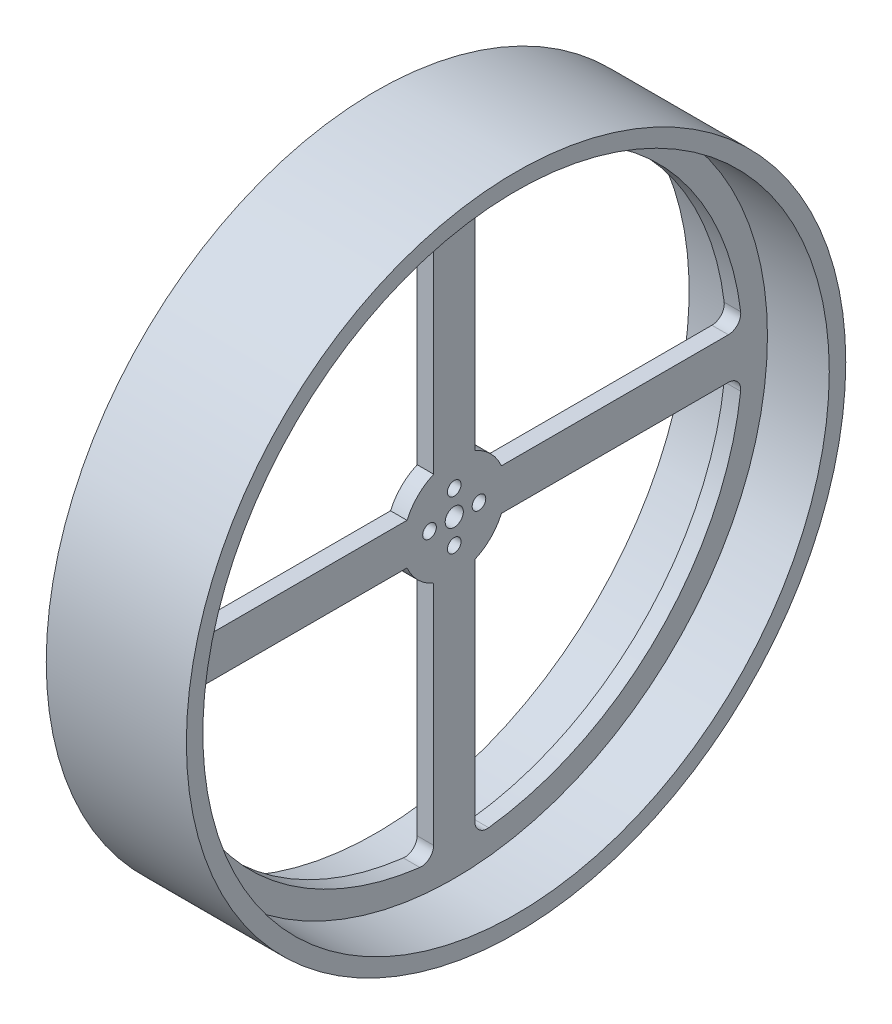
ISO-10303-21;
HEADER;
FILE_DESCRIPTION(('STEP AP214'),'2;1');
FILE_NAME('part.step','',(''),(''),'','','');
FILE_SCHEMA(('AUTOMOTIVE_DESIGN { 1 0 10303 214 1 1 1 1 }'));
ENDSEC;
DATA;
#1=APPLICATION_CONTEXT('core data for automotive mechanical design processes');
#2=APPLICATION_PROTOCOL_DEFINITION('international standard','automotive_design',2000,#1);
#3=PRODUCT_CONTEXT('',#1,'mechanical');
#4=PRODUCT('Part','Part','',(#3));
#5=PRODUCT_RELATED_PRODUCT_CATEGORY('part','',(#4));
#6=PRODUCT_DEFINITION_FORMATION('','',#4);
#7=PRODUCT_DEFINITION_CONTEXT('part definition',#1,'design');
#8=PRODUCT_DEFINITION('design','',#6,#7);
#9=PRODUCT_DEFINITION_SHAPE('','',#8);
#10=(LENGTH_UNIT() NAMED_UNIT(*) SI_UNIT(.MILLI.,.METRE.));
#11=(NAMED_UNIT(*) PLANE_ANGLE_UNIT() SI_UNIT($,.RADIAN.));
#12=(NAMED_UNIT(*) SI_UNIT($,.STERADIAN.) SOLID_ANGLE_UNIT());
#13=UNCERTAINTY_MEASURE_WITH_UNIT(LENGTH_MEASURE(1.E-05),#10,'distance_accuracy_value','');
#14=(GEOMETRIC_REPRESENTATION_CONTEXT(3) GLOBAL_UNCERTAINTY_ASSIGNED_CONTEXT((#13)) GLOBAL_UNIT_ASSIGNED_CONTEXT((#10,
#11,#12)) REPRESENTATION_CONTEXT('',''));
#15=CARTESIAN_POINT('',(0.,0.,0.));
#16=DIRECTION('',(0.,0.,1.));
#17=DIRECTION('',(1.,0.,0.));
#18=AXIS2_PLACEMENT_3D('',#15,#16,#17);
#19=CARTESIAN_POINT('',(4.,0.,0.));
#20=DIRECTION('',(1.,0.,0.));
#21=DIRECTION('',(0.,0.,-1.));
#22=AXIS2_PLACEMENT_3D('',#19,#20,#21);
#23=PLANE('',#22);
#24=CARTESIAN_POINT('',(4.,-6.,0.));
#25=DIRECTION('',(1.,0.,0.));
#26=DIRECTION('',(0.,0.,-1.));
#27=AXIS2_PLACEMENT_3D('',#24,#25,#26);
#28=CIRCLE('',#27,1.65);
#29=CARTESIAN_POINT('',(4.,-6.,-1.65));
#30=VERTEX_POINT('',#29);
#31=EDGE_CURVE('E338',#30,#30,#28,.T.);
#32=ORIENTED_EDGE('',*,*,#31,.F.);
#33=EDGE_LOOP('',(#32));
#34=FACE_BOUND('',#33,.T.);
#35=CARTESIAN_POINT('',(4.,0.,-6.));
#36=DIRECTION('',(1.,0.,0.));
#37=DIRECTION('',(0.,0.,-1.));
#38=AXIS2_PLACEMENT_3D('',#35,#36,#37);
#39=CIRCLE('',#38,1.65);
#40=CARTESIAN_POINT('',(4.,0.,-7.65));
#41=VERTEX_POINT('',#40);
#42=EDGE_CURVE('E334',#41,#41,#39,.T.);
#43=ORIENTED_EDGE('',*,*,#42,.F.);
#44=EDGE_LOOP('',(#43));
#45=FACE_BOUND('',#44,.T.);
#46=CARTESIAN_POINT('',(4.,6.,0.));
#47=DIRECTION('',(1.,0.,0.));
#48=DIRECTION('',(0.,0.,-1.));
#49=AXIS2_PLACEMENT_3D('',#46,#47,#48);
#50=CIRCLE('',#49,1.65);
#51=CARTESIAN_POINT('',(4.,6.,-1.65));
#52=VERTEX_POINT('',#51);
#53=EDGE_CURVE('E328',#52,#52,#50,.T.);
#54=ORIENTED_EDGE('',*,*,#53,.F.);
#55=EDGE_LOOP('',(#54));
#56=FACE_BOUND('',#55,.T.);
#57=CARTESIAN_POINT('',(4.,0.,6.));
#58=DIRECTION('',(1.,0.,0.));
#59=DIRECTION('',(0.,0.,-1.));
#60=AXIS2_PLACEMENT_3D('',#57,#58,#59);
#61=CIRCLE('',#60,1.65);
#62=CARTESIAN_POINT('',(4.,0.,4.35));
#63=VERTEX_POINT('',#62);
#64=EDGE_CURVE('E323',#63,#63,#61,.T.);
#65=ORIENTED_EDGE('',*,*,#64,.F.);
#66=EDGE_LOOP('',(#65));
#67=FACE_BOUND('',#66,.T.);
#68=CARTESIAN_POINT('',(4.,0.,0.));
#69=DIRECTION('',(1.,0.,0.));
#70=DIRECTION('',(0.,0.,1.));
#71=AXIS2_PLACEMENT_3D('',#68,#69,#70);
#72=CIRCLE('',#71,70.);
#73=CARTESIAN_POINT('',(4.,69.4992110966795,8.35820895522388));
#74=VERTEX_POINT('',#73);
#75=CARTESIAN_POINT('',(4.,8.35820895522388,69.4992110966795));
#76=VERTEX_POINT('',#75);
#77=EDGE_CURVE('E212',#74,#76,#72,.T.);
#78=ORIENTED_EDGE('',*,*,#77,.F.);
#79=CARTESIAN_POINT('',(4.,66.5206734782503,8.));
#80=DIRECTION('',(1.,0.,0.));
#81=DIRECTION('',(0.,0.,-1.));
#82=AXIS2_PLACEMENT_3D('',#79,#80,#81);
#83=CIRCLE('',#82,3.);
#84=CARTESIAN_POINT('',(4.,66.5206734782503,5.));
#85=VERTEX_POINT('',#84);
#86=EDGE_CURVE('E405',#74,#85,#83,.F.);
#87=ORIENTED_EDGE('',*,*,#86,.T.);
#88=DIRECTION('',(0.,1.,0.));
#89=VECTOR('',#88,1.);
#90=CARTESIAN_POINT('',(4.,11.4564392373896,5.));
#91=LINE('',#90,#89);
#92=CARTESIAN_POINT('',(4.,11.4564392373896,5.));
#93=VERTEX_POINT('',#92);
#94=EDGE_CURVE('E296',#93,#85,#91,.T.);
#95=ORIENTED_EDGE('',*,*,#94,.F.);
#96=CARTESIAN_POINT('',(4.,0.,0.));
#97=DIRECTION('',(-1.,0.,0.));
#98=DIRECTION('',(0.,0.,1.));
#99=AXIS2_PLACEMENT_3D('',#96,#97,#98);
#100=CIRCLE('',#99,12.5);
#101=CARTESIAN_POINT('',(4.,4.99999999999999,11.4564392373896));
#102=VERTEX_POINT('',#101);
#103=EDGE_CURVE('E311',#102,#93,#100,.T.);
#104=ORIENTED_EDGE('',*,*,#103,.F.);
#105=DIRECTION('',(0.,0.,-1.));
#106=VECTOR('',#105,1.);
#107=CARTESIAN_POINT('',(4.,4.99999999999999,11.4564392373896));
#108=LINE('',#107,#106);
#109=CARTESIAN_POINT('',(4.,5.,66.5206734782503));
#110=VERTEX_POINT('',#109);
#111=EDGE_CURVE('E307',#110,#102,#108,.T.);
#112=ORIENTED_EDGE('',*,*,#111,.F.);
#113=CARTESIAN_POINT('',(4.,8.,66.5206734782503));
#114=DIRECTION('',(1.,0.,0.));
#115=DIRECTION('',(0.,0.,-1.));
#116=AXIS2_PLACEMENT_3D('',#113,#114,#115);
#117=CIRCLE('',#116,3.);
#118=EDGE_CURVE('E50',#110,#76,#117,.F.);
#119=ORIENTED_EDGE('',*,*,#118,.T.);
#120=EDGE_LOOP('',(#78,#87,#95,#104,#112,#119));
#121=FACE_BOUND('',#120,.T.);
#122=CARTESIAN_POINT('',(4.,0.,0.));
#123=DIRECTION('',(1.,0.,0.));
#124=DIRECTION('',(0.,-1.,0.));
#125=AXIS2_PLACEMENT_3D('',#122,#123,#124);
#126=CIRCLE('',#125,70.);
#127=CARTESIAN_POINT('',(4.,-8.35820895522315,69.4992110966796));
#128=VERTEX_POINT('',#127);
#129=CARTESIAN_POINT('',(4.,-69.4992110966794,8.35820895522461));
#130=VERTEX_POINT('',#129);
#131=EDGE_CURVE('E281',#128,#130,#126,.T.);
#132=ORIENTED_EDGE('',*,*,#131,.F.);
#133=CARTESIAN_POINT('',(4.,-7.9999999999993,66.5206734782504));
#134=DIRECTION('',(1.,0.,0.));
#135=DIRECTION('',(0.,0.,-1.));
#136=AXIS2_PLACEMENT_3D('',#133,#134,#135);
#137=CIRCLE('',#136,3.);
#138=CARTESIAN_POINT('',(4.,-4.9999999999993,66.5206734782504));
#139=VERTEX_POINT('',#138);
#140=EDGE_CURVE('E407',#128,#139,#137,.F.);
#141=ORIENTED_EDGE('',*,*,#140,.T.);
#142=DIRECTION('',(0.,0.,1.));
#143=VECTOR('',#142,1.);
#144=CARTESIAN_POINT('',(4.,-4.99999999999988,11.4564392373897));
#145=LINE('',#144,#143);
#146=CARTESIAN_POINT('',(4.,-4.99999999999988,11.4564392373897));
#147=VERTEX_POINT('',#146);
#148=EDGE_CURVE('E275',#147,#139,#145,.T.);
#149=ORIENTED_EDGE('',*,*,#148,.F.);
#150=CARTESIAN_POINT('',(4.,0.,0.));
#151=DIRECTION('',(-1.,0.,0.));
#152=DIRECTION('',(0.,-1.,0.));
#153=AXIS2_PLACEMENT_3D('',#150,#151,#152);
#154=CIRCLE('',#153,12.5);
#155=CARTESIAN_POINT('',(4.,-11.4564392373896,5.00000000000011));
#156=VERTEX_POINT('',#155);
#157=EDGE_CURVE('E290',#156,#147,#154,.T.);
#158=ORIENTED_EDGE('',*,*,#157,.F.);
#159=DIRECTION('',(0.,1.,0.));
#160=VECTOR('',#159,1.);
#161=CARTESIAN_POINT('',(4.,-11.4564392373896,5.00000000000011));
#162=LINE('',#161,#160);
#163=CARTESIAN_POINT('',(4.,-66.5206734782503,5.0000000000007));
#164=VERTEX_POINT('',#163);
#165=EDGE_CURVE('E282',#164,#156,#162,.T.);
#166=ORIENTED_EDGE('',*,*,#165,.F.);
#167=CARTESIAN_POINT('',(4.,-66.5206734782503,8.0000000000007));
#168=DIRECTION('',(1.,0.,0.));
#169=DIRECTION('',(0.,0.,-1.));
#170=AXIS2_PLACEMENT_3D('',#167,#168,#169);
#171=CIRCLE('',#170,3.);
#172=EDGE_CURVE('E385',#164,#130,#171,.F.);
#173=ORIENTED_EDGE('',*,*,#172,.T.);
#174=EDGE_LOOP('',(#132,#141,#149,#158,#166,#173));
#175=FACE_BOUND('',#174,.T.);
#176=CARTESIAN_POINT('',(4.,0.,0.));
#177=DIRECTION('',(1.,0.,0.));
#178=DIRECTION('',(0.,0.,-1.));
#179=AXIS2_PLACEMENT_3D('',#176,#177,#178);
#180=CIRCLE('',#179,70.);
#181=CARTESIAN_POINT('',(4.,-69.4992110966795,-8.35820895522388));
#182=VERTEX_POINT('',#181);
#183=CARTESIAN_POINT('',(4.,-8.35820895522388,-69.4992110966795));
#184=VERTEX_POINT('',#183);
#185=EDGE_CURVE('E251',#182,#184,#180,.T.);
#186=ORIENTED_EDGE('',*,*,#185,.F.);
#187=CARTESIAN_POINT('',(4.,-66.5206734782503,-8.));
#188=DIRECTION('',(1.,0.,0.));
#189=DIRECTION('',(0.,0.,-1.));
#190=AXIS2_PLACEMENT_3D('',#187,#188,#189);
#191=CIRCLE('',#190,3.);
#192=CARTESIAN_POINT('',(4.,-66.5206734782503,-5.));
#193=VERTEX_POINT('',#192);
#194=EDGE_CURVE('E387',#182,#193,#191,.F.);
#195=ORIENTED_EDGE('',*,*,#194,.T.);
#196=DIRECTION('',(0.,-1.,0.));
#197=VECTOR('',#196,1.);
#198=CARTESIAN_POINT('',(4.,-11.4564392373896,-5.));
#199=LINE('',#198,#197);
#200=CARTESIAN_POINT('',(4.,-11.4564392373896,-5.));
#201=VERTEX_POINT('',#200);
#202=EDGE_CURVE('E244',#201,#193,#199,.T.);
#203=ORIENTED_EDGE('',*,*,#202,.F.);
#204=CARTESIAN_POINT('',(4.,0.,0.));
#205=DIRECTION('',(-1.,0.,0.));
#206=DIRECTION('',(0.,0.,-1.));
#207=AXIS2_PLACEMENT_3D('',#204,#205,#206);
#208=CIRCLE('',#207,12.5);
#209=CARTESIAN_POINT('',(4.,-4.99999999999999,-11.4564392373896));
#210=VERTEX_POINT('',#209);
#211=EDGE_CURVE('E258',#210,#201,#208,.T.);
#212=ORIENTED_EDGE('',*,*,#211,.F.);
#213=DIRECTION('',(0.,0.,1.));
#214=VECTOR('',#213,1.);
#215=CARTESIAN_POINT('',(4.,-4.99999999999999,-11.4564392373896));
#216=LINE('',#215,#214);
#217=CARTESIAN_POINT('',(4.,-5.,-66.5206734782503));
#218=VERTEX_POINT('',#217);
#219=EDGE_CURVE('E260',#218,#210,#216,.T.);
#220=ORIENTED_EDGE('',*,*,#219,.F.);
#221=CARTESIAN_POINT('',(4.,-8.,-66.5206734782503));
#222=DIRECTION('',(1.,0.,0.));
#223=DIRECTION('',(0.,0.,-1.));
#224=AXIS2_PLACEMENT_3D('',#221,#222,#223);
#225=CIRCLE('',#224,3.);
#226=EDGE_CURVE('E388',#218,#184,#225,.F.);
#227=ORIENTED_EDGE('',*,*,#226,.T.);
#228=EDGE_LOOP('',(#186,#195,#203,#212,#220,#227));
#229=FACE_BOUND('',#228,.T.);
#230=CARTESIAN_POINT('',(4.,0.,0.));
#231=DIRECTION('',(1.,0.,0.));
#232=DIRECTION('',(0.,1.,0.));
#233=AXIS2_PLACEMENT_3D('',#230,#231,#232);
#234=CIRCLE('',#233,70.);
#235=CARTESIAN_POINT('',(4.,8.35820895522364,-69.4992110966795));
#236=VERTEX_POINT('',#235);
#237=CARTESIAN_POINT('',(4.,69.4992110966794,-8.35820895522412));
#238=VERTEX_POINT('',#237);
#239=EDGE_CURVE('E233',#236,#238,#234,.T.);
#240=ORIENTED_EDGE('',*,*,#239,.F.);
#241=CARTESIAN_POINT('',(4.,7.99999999999977,-66.5206734782504));
#242=DIRECTION('',(1.,0.,0.));
#243=DIRECTION('',(0.,0.,-1.));
#244=AXIS2_PLACEMENT_3D('',#241,#242,#243);
#245=CIRCLE('',#244,3.);
#246=CARTESIAN_POINT('',(4.,4.99999999999977,-66.5206734782504));
#247=VERTEX_POINT('',#246);
#248=EDGE_CURVE('E392',#236,#247,#245,.F.);
#249=ORIENTED_EDGE('',*,*,#248,.T.);
#250=DIRECTION('',(0.,0.,-1.));
#251=VECTOR('',#250,1.);
#252=CARTESIAN_POINT('',(4.,4.99999999999996,-11.4564392373896));
#253=LINE('',#252,#251);
#254=CARTESIAN_POINT('',(4.,4.99999999999996,-11.4564392373896));
#255=VERTEX_POINT('',#254);
#256=EDGE_CURVE('E238',#255,#247,#253,.T.);
#257=ORIENTED_EDGE('',*,*,#256,.F.);
#258=CARTESIAN_POINT('',(4.,0.,0.));
#259=DIRECTION('',(-1.,0.,0.));
#260=DIRECTION('',(0.,1.,0.));
#261=AXIS2_PLACEMENT_3D('',#258,#259,#260);
#262=CIRCLE('',#261,12.5);
#263=CARTESIAN_POINT('',(4.,11.4564392373896,-5.00000000000003));
#264=VERTEX_POINT('',#263);
#265=EDGE_CURVE('E210',#264,#255,#262,.T.);
#266=ORIENTED_EDGE('',*,*,#265,.F.);
#267=DIRECTION('',(0.,-1.,0.));
#268=VECTOR('',#267,1.);
#269=CARTESIAN_POINT('',(4.,11.4564392373896,-5.00000000000003));
#270=LINE('',#269,#268);
#271=CARTESIAN_POINT('',(4.,66.5206734782503,-5.00000000000023));
#272=VERTEX_POINT('',#271);
#273=EDGE_CURVE('E234',#272,#264,#270,.T.);
#274=ORIENTED_EDGE('',*,*,#273,.F.);
#275=CARTESIAN_POINT('',(4.,66.5206734782503,-8.00000000000023));
#276=DIRECTION('',(1.,0.,0.));
#277=DIRECTION('',(0.,0.,-1.));
#278=AXIS2_PLACEMENT_3D('',#275,#276,#277);
#279=CIRCLE('',#278,3.);
#280=EDGE_CURVE('E398',#272,#238,#279,.F.);
#281=ORIENTED_EDGE('',*,*,#280,.T.);
#282=EDGE_LOOP('',(#240,#249,#257,#266,#274,#281));
#283=FACE_BOUND('',#282,.T.);
#284=CARTESIAN_POINT('',(4.,0.,0.));
#285=DIRECTION('',(1.,0.,0.));
#286=DIRECTION('',(0.,0.,-1.));
#287=AXIS2_PLACEMENT_3D('',#284,#285,#286);
#288=CIRCLE('',#287,2.2);
#289=CARTESIAN_POINT('',(4.,0.,-2.2));
#290=VERTEX_POINT('',#289);
#291=EDGE_CURVE('E501',#290,#290,#288,.T.);
#292=ORIENTED_EDGE('',*,*,#291,.F.);
#293=EDGE_LOOP('',(#292));
#294=FACE_BOUND('',#293,.T.);
#295=CARTESIAN_POINT('',(4.,0.,0.));
#296=DIRECTION('',(1.,0.,0.));
#297=DIRECTION('',(0.,0.,-1.));
#298=AXIS2_PLACEMENT_3D('',#295,#296,#297);
#299=CIRCLE('',#298,76.);
#300=CARTESIAN_POINT('',(4.,0.,-76.));
#301=VERTEX_POINT('',#300);
#302=EDGE_CURVE('E507',#301,#301,#299,.T.);
#303=ORIENTED_EDGE('',*,*,#302,.T.);
#304=EDGE_LOOP('',(#303));
#305=FACE_BOUND('',#304,.T.);
#306=ADVANCED_FACE('F39',(#34,#45,#56,#67,#121,#175,#229,#283,#294,#305),#23,.T.);
#307=CARTESIAN_POINT('',(0.,0.,0.));
#308=DIRECTION('',(1.,0.,0.));
#309=DIRECTION('',(0.,0.,-1.));
#310=AXIS2_PLACEMENT_3D('',#307,#308,#309);
#311=PLANE('',#310);
#312=CARTESIAN_POINT('',(0.,0.,0.));
#313=DIRECTION('',(1.,0.,0.));
#314=DIRECTION('',(0.,0.,-1.));
#315=AXIS2_PLACEMENT_3D('',#312,#313,#314);
#316=CIRCLE('',#315,2.2);
#317=CARTESIAN_POINT('',(0.,0.,-2.2));
#318=VERTEX_POINT('',#317);
#319=EDGE_CURVE('E496',#318,#318,#316,.T.);
#320=ORIENTED_EDGE('',*,*,#319,.T.);
#321=EDGE_LOOP('',(#320));
#322=FACE_BOUND('',#321,.T.);
#323=CARTESIAN_POINT('',(0.,-6.,0.));
#324=DIRECTION('',(1.,0.,0.));
#325=DIRECTION('',(0.,0.,-1.));
#326=AXIS2_PLACEMENT_3D('',#323,#324,#325);
#327=CIRCLE('',#326,1.65);
#328=CARTESIAN_POINT('',(0.,-6.,-1.65));
#329=VERTEX_POINT('',#328);
#330=EDGE_CURVE('E319',#329,#329,#327,.T.);
#331=ORIENTED_EDGE('',*,*,#330,.T.);
#332=EDGE_LOOP('',(#331));
#333=FACE_BOUND('',#332,.T.);
#334=CARTESIAN_POINT('',(0.,0.,-6.));
#335=DIRECTION('',(1.,0.,0.));
#336=DIRECTION('',(0.,0.,-1.));
#337=AXIS2_PLACEMENT_3D('',#334,#335,#336);
#338=CIRCLE('',#337,1.65);
#339=CARTESIAN_POINT('',(0.,0.,-7.65));
#340=VERTEX_POINT('',#339);
#341=EDGE_CURVE('E340',#340,#340,#338,.T.);
#342=ORIENTED_EDGE('',*,*,#341,.T.);
#343=EDGE_LOOP('',(#342));
#344=FACE_BOUND('',#343,.T.);
#345=CARTESIAN_POINT('',(0.,6.,0.));
#346=DIRECTION('',(1.,0.,0.));
#347=DIRECTION('',(0.,0.,-1.));
#348=AXIS2_PLACEMENT_3D('',#345,#346,#347);
#349=CIRCLE('',#348,1.65);
#350=CARTESIAN_POINT('',(0.,6.,-1.65));
#351=VERTEX_POINT('',#350);
#352=EDGE_CURVE('E332',#351,#351,#349,.T.);
#353=ORIENTED_EDGE('',*,*,#352,.T.);
#354=EDGE_LOOP('',(#353));
#355=FACE_BOUND('',#354,.T.);
#356=CARTESIAN_POINT('',(0.,0.,6.));
#357=DIRECTION('',(1.,0.,0.));
#358=DIRECTION('',(0.,0.,-1.));
#359=AXIS2_PLACEMENT_3D('',#356,#357,#358);
#360=CIRCLE('',#359,1.65);
#361=CARTESIAN_POINT('',(0.,0.,4.35));
#362=VERTEX_POINT('',#361);
#363=EDGE_CURVE('E322',#362,#362,#360,.T.);
#364=ORIENTED_EDGE('',*,*,#363,.T.);
#365=EDGE_LOOP('',(#364));
#366=FACE_BOUND('',#365,.T.);
#367=DIRECTION('',(0.,1.,0.));
#368=VECTOR('',#367,1.);
#369=CARTESIAN_POINT('',(0.,11.4564392373896,5.));
#370=LINE('',#369,#368);
#371=CARTESIAN_POINT('',(0.,11.4564392373896,5.));
#372=VERTEX_POINT('',#371);
#373=CARTESIAN_POINT('',(0.,66.5206734782503,5.));
#374=VERTEX_POINT('',#373);
#375=EDGE_CURVE('E303',#372,#374,#370,.T.);
#376=ORIENTED_EDGE('',*,*,#375,.T.);
#377=CARTESIAN_POINT('',(0.,66.5206734782503,8.));
#378=DIRECTION('',(1.,0.,0.));
#379=DIRECTION('',(0.,0.,-1.));
#380=AXIS2_PLACEMENT_3D('',#377,#378,#379);
#381=CIRCLE('',#380,3.);
#382=CARTESIAN_POINT('',(0.,69.4992110966795,8.35820895522388));
#383=VERTEX_POINT('',#382);
#384=EDGE_CURVE('E404',#374,#383,#381,.T.);
#385=ORIENTED_EDGE('',*,*,#384,.T.);
#386=CARTESIAN_POINT('',(0.,0.,0.));
#387=DIRECTION('',(1.,0.,0.));
#388=DIRECTION('',(0.,0.,1.));
#389=AXIS2_PLACEMENT_3D('',#386,#387,#388);
#390=CIRCLE('',#389,70.);
#391=CARTESIAN_POINT('',(0.,8.35820895522388,69.4992110966795));
#392=VERTEX_POINT('',#391);
#393=EDGE_CURVE('E294',#383,#392,#390,.T.);
#394=ORIENTED_EDGE('',*,*,#393,.T.);
#395=CARTESIAN_POINT('',(0.,8.,66.5206734782503));
#396=DIRECTION('',(1.,0.,0.));
#397=DIRECTION('',(0.,0.,-1.));
#398=AXIS2_PLACEMENT_3D('',#395,#396,#397);
#399=CIRCLE('',#398,3.);
#400=CARTESIAN_POINT('',(0.,5.,66.5206734782503));
#401=VERTEX_POINT('',#400);
#402=EDGE_CURVE('E11',#392,#401,#399,.T.);
#403=ORIENTED_EDGE('',*,*,#402,.T.);
#404=DIRECTION('',(0.,0.,-1.));
#405=VECTOR('',#404,1.);
#406=CARTESIAN_POINT('',(0.,4.99999999999999,11.4564392373896));
#407=LINE('',#406,#405);
#408=CARTESIAN_POINT('',(0.,4.99999999999999,11.4564392373896));
#409=VERTEX_POINT('',#408);
#410=EDGE_CURVE('E300',#401,#409,#407,.T.);
#411=ORIENTED_EDGE('',*,*,#410,.T.);
#412=CARTESIAN_POINT('',(0.,0.,0.));
#413=DIRECTION('',(-1.,0.,0.));
#414=DIRECTION('',(0.,0.,1.));
#415=AXIS2_PLACEMENT_3D('',#412,#413,#414);
#416=CIRCLE('',#415,12.5);
#417=EDGE_CURVE('E297',#409,#372,#416,.T.);
#418=ORIENTED_EDGE('',*,*,#417,.T.);
#419=EDGE_LOOP('',(#376,#385,#394,#403,#411,#418));
#420=FACE_BOUND('',#419,.T.);
#421=DIRECTION('',(0.,0.,1.));
#422=VECTOR('',#421,1.);
#423=CARTESIAN_POINT('',(0.,-4.99999999999988,11.4564392373897));
#424=LINE('',#423,#422);
#425=CARTESIAN_POINT('',(0.,-4.99999999999988,11.4564392373897));
#426=VERTEX_POINT('',#425);
#427=CARTESIAN_POINT('',(0.,-4.9999999999993,66.5206734782504));
#428=VERTEX_POINT('',#427);
#429=EDGE_CURVE('E280',#426,#428,#424,.T.);
#430=ORIENTED_EDGE('',*,*,#429,.T.);
#431=CARTESIAN_POINT('',(0.,-7.9999999999993,66.5206734782504));
#432=DIRECTION('',(1.,0.,0.));
#433=DIRECTION('',(0.,0.,-1.));
#434=AXIS2_PLACEMENT_3D('',#431,#432,#433);
#435=CIRCLE('',#434,3.);
#436=CARTESIAN_POINT('',(0.,-8.35820895522315,69.4992110966796));
#437=VERTEX_POINT('',#436);
#438=EDGE_CURVE('E409',#428,#437,#435,.T.);
#439=ORIENTED_EDGE('',*,*,#438,.T.);
#440=CARTESIAN_POINT('',(0.,0.,0.));
#441=DIRECTION('',(1.,0.,0.));
#442=DIRECTION('',(0.,-1.,0.));
#443=AXIS2_PLACEMENT_3D('',#440,#441,#442);
#444=CIRCLE('',#443,70.);
#445=CARTESIAN_POINT('',(0.,-69.4992110966794,8.35820895522461));
#446=VERTEX_POINT('',#445);
#447=EDGE_CURVE('E268',#437,#446,#444,.T.);
#448=ORIENTED_EDGE('',*,*,#447,.T.);
#449=CARTESIAN_POINT('',(0.,-66.5206734782503,8.0000000000007));
#450=DIRECTION('',(1.,0.,0.));
#451=DIRECTION('',(0.,0.,-1.));
#452=AXIS2_PLACEMENT_3D('',#449,#450,#451);
#453=CIRCLE('',#452,3.);
#454=CARTESIAN_POINT('',(0.,-66.5206734782503,5.0000000000007));
#455=VERTEX_POINT('',#454);
#456=EDGE_CURVE('E381',#446,#455,#453,.T.);
#457=ORIENTED_EDGE('',*,*,#456,.T.);
#458=DIRECTION('',(0.,1.,0.));
#459=VECTOR('',#458,1.);
#460=CARTESIAN_POINT('',(0.,-11.4564392373896,5.00000000000011));
#461=LINE('',#460,#459);
#462=CARTESIAN_POINT('',(0.,-11.4564392373896,5.00000000000011));
#463=VERTEX_POINT('',#462);
#464=EDGE_CURVE('E272',#455,#463,#461,.T.);
#465=ORIENTED_EDGE('',*,*,#464,.T.);
#466=CARTESIAN_POINT('',(0.,0.,0.));
#467=DIRECTION('',(-1.,0.,0.));
#468=DIRECTION('',(0.,-1.,0.));
#469=AXIS2_PLACEMENT_3D('',#466,#467,#468);
#470=CIRCLE('',#469,12.5);
#471=EDGE_CURVE('E274',#463,#426,#470,.T.);
#472=ORIENTED_EDGE('',*,*,#471,.T.);
#473=EDGE_LOOP('',(#430,#439,#448,#457,#465,#472));
#474=FACE_BOUND('',#473,.T.);
#475=DIRECTION('',(0.,-1.,0.));
#476=VECTOR('',#475,1.);
#477=CARTESIAN_POINT('',(0.,-11.4564392373896,-5.));
#478=LINE('',#477,#476);
#479=CARTESIAN_POINT('',(0.,-11.4564392373896,-5.));
#480=VERTEX_POINT('',#479);
#481=CARTESIAN_POINT('',(0.,-66.5206734782503,-5.));
#482=VERTEX_POINT('',#481);
#483=EDGE_CURVE('E249',#480,#482,#478,.T.);
#484=ORIENTED_EDGE('',*,*,#483,.T.);
#485=CARTESIAN_POINT('',(0.,-66.5206734782503,-8.));
#486=DIRECTION('',(1.,0.,0.));
#487=DIRECTION('',(0.,0.,-1.));
#488=AXIS2_PLACEMENT_3D('',#485,#486,#487);
#489=CIRCLE('',#488,3.);
#490=CARTESIAN_POINT('',(0.,-69.4992110966795,-8.35820895522388));
#491=VERTEX_POINT('',#490);
#492=EDGE_CURVE('E389',#482,#491,#489,.T.);
#493=ORIENTED_EDGE('',*,*,#492,.T.);
#494=CARTESIAN_POINT('',(0.,0.,0.));
#495=DIRECTION('',(1.,0.,0.));
#496=DIRECTION('',(0.,0.,-1.));
#497=AXIS2_PLACEMENT_3D('',#494,#495,#496);
#498=CIRCLE('',#497,70.);
#499=CARTESIAN_POINT('',(0.,-8.35820895522388,-69.4992110966795));
#500=VERTEX_POINT('',#499);
#501=EDGE_CURVE('E241',#491,#500,#498,.T.);
#502=ORIENTED_EDGE('',*,*,#501,.T.);
#503=CARTESIAN_POINT('',(0.,-8.,-66.5206734782503));
#504=DIRECTION('',(1.,0.,0.));
#505=DIRECTION('',(0.,0.,-1.));
#506=AXIS2_PLACEMENT_3D('',#503,#504,#505);
#507=CIRCLE('',#506,3.);
#508=CARTESIAN_POINT('',(0.,-5.,-66.5206734782503));
#509=VERTEX_POINT('',#508);
#510=EDGE_CURVE('E395',#500,#509,#507,.T.);
#511=ORIENTED_EDGE('',*,*,#510,.T.);
#512=DIRECTION('',(0.,0.,1.));
#513=VECTOR('',#512,1.);
#514=CARTESIAN_POINT('',(0.,-4.99999999999999,-11.4564392373896));
#515=LINE('',#514,#513);
#516=CARTESIAN_POINT('',(0.,-4.99999999999999,-11.4564392373896));
#517=VERTEX_POINT('',#516);
#518=EDGE_CURVE('E242',#509,#517,#515,.T.);
#519=ORIENTED_EDGE('',*,*,#518,.T.);
#520=CARTESIAN_POINT('',(0.,0.,0.));
#521=DIRECTION('',(-1.,0.,0.));
#522=DIRECTION('',(0.,0.,-1.));
#523=AXIS2_PLACEMENT_3D('',#520,#521,#522);
#524=CIRCLE('',#523,12.5);
#525=EDGE_CURVE('E250',#517,#480,#524,.T.);
#526=ORIENTED_EDGE('',*,*,#525,.T.);
#527=EDGE_LOOP('',(#484,#493,#502,#511,#519,#526));
#528=FACE_BOUND('',#527,.T.);
#529=DIRECTION('',(0.,0.,-1.));
#530=VECTOR('',#529,1.);
#531=CARTESIAN_POINT('',(0.,4.99999999999996,-11.4564392373896));
#532=LINE('',#531,#530);
#533=CARTESIAN_POINT('',(0.,4.99999999999996,-11.4564392373896));
#534=VERTEX_POINT('',#533);
#535=CARTESIAN_POINT('',(0.,4.99999999999977,-66.5206734782504));
#536=VERTEX_POINT('',#535);
#537=EDGE_CURVE('E213',#534,#536,#532,.T.);
#538=ORIENTED_EDGE('',*,*,#537,.T.);
#539=CARTESIAN_POINT('',(0.,7.99999999999977,-66.5206734782504));
#540=DIRECTION('',(1.,0.,0.));
#541=DIRECTION('',(0.,0.,-1.));
#542=AXIS2_PLACEMENT_3D('',#539,#540,#541);
#543=CIRCLE('',#542,3.);
#544=CARTESIAN_POINT('',(0.,8.35820895522364,-69.4992110966795));
#545=VERTEX_POINT('',#544);
#546=EDGE_CURVE('E397',#536,#545,#543,.T.);
#547=ORIENTED_EDGE('',*,*,#546,.T.);
#548=CARTESIAN_POINT('',(0.,0.,0.));
#549=DIRECTION('',(1.,0.,0.));
#550=DIRECTION('',(0.,1.,0.));
#551=AXIS2_PLACEMENT_3D('',#548,#549,#550);
#552=CIRCLE('',#551,70.);
#553=CARTESIAN_POINT('',(0.,69.4992110966794,-8.35820895522412));
#554=VERTEX_POINT('',#553);
#555=EDGE_CURVE('E227',#545,#554,#552,.T.);
#556=ORIENTED_EDGE('',*,*,#555,.T.);
#557=CARTESIAN_POINT('',(0.,66.5206734782503,-8.00000000000023));
#558=DIRECTION('',(1.,0.,0.));
#559=DIRECTION('',(0.,0.,-1.));
#560=AXIS2_PLACEMENT_3D('',#557,#558,#559);
#561=CIRCLE('',#560,3.);
#562=CARTESIAN_POINT('',(0.,66.5206734782503,-5.00000000000023));
#563=VERTEX_POINT('',#562);
#564=EDGE_CURVE('E396',#554,#563,#561,.T.);
#565=ORIENTED_EDGE('',*,*,#564,.T.);
#566=DIRECTION('',(0.,-1.,0.));
#567=VECTOR('',#566,1.);
#568=CARTESIAN_POINT('',(0.,11.4564392373896,-5.00000000000003));
#569=LINE('',#568,#567);
#570=CARTESIAN_POINT('',(0.,11.4564392373896,-5.00000000000003));
#571=VERTEX_POINT('',#570);
#572=EDGE_CURVE('E221',#563,#571,#569,.T.);
#573=ORIENTED_EDGE('',*,*,#572,.T.);
#574=CARTESIAN_POINT('',(0.,0.,0.));
#575=DIRECTION('',(-1.,0.,0.));
#576=DIRECTION('',(0.,1.,0.));
#577=AXIS2_PLACEMENT_3D('',#574,#575,#576);
#578=CIRCLE('',#577,12.5);
#579=EDGE_CURVE('E204',#571,#534,#578,.T.);
#580=ORIENTED_EDGE('',*,*,#579,.T.);
#581=EDGE_LOOP('',(#538,#547,#556,#565,#573,#580));
#582=FACE_BOUND('',#581,.T.);
#583=CARTESIAN_POINT('',(0.,0.,0.));
#584=DIRECTION('',(-1.,0.,0.));
#585=DIRECTION('',(0.,0.,1.));
#586=AXIS2_PLACEMENT_3D('',#583,#584,#585);
#587=CIRCLE('',#586,76.);
#588=CARTESIAN_POINT('',(0.,0.,76.));
#589=VERTEX_POINT('',#588);
#590=EDGE_CURVE('E491',#589,#589,#587,.T.);
#591=ORIENTED_EDGE('',*,*,#590,.T.);
#592=EDGE_LOOP('',(#591));
#593=FACE_BOUND('',#592,.T.);
#594=ADVANCED_FACE('F225',(#322,#333,#344,#355,#366,#420,#474,#528,#582,#593),#311,.F.);
#595=CARTESIAN_POINT('',(4.,0.,0.));
#596=DIRECTION('',(-1.,0.,0.));
#597=DIRECTION('',(0.,0.,1.));
#598=AXIS2_PLACEMENT_3D('',#595,#596,#597);
#599=CYLINDRICAL_SURFACE('',#598,80.);
#600=CARTESIAN_POINT('',(-15.,0.,0.));
#601=DIRECTION('',(-1.,0.,0.));
#602=DIRECTION('',(0.,0.,1.));
#603=AXIS2_PLACEMENT_3D('',#600,#601,#602);
#604=CIRCLE('',#603,80.);
#605=CARTESIAN_POINT('',(-15.,0.,80.));
#606=VERTEX_POINT('',#605);
#607=EDGE_CURVE('E284',#606,#606,#604,.T.);
#608=ORIENTED_EDGE('',*,*,#607,.F.);
#609=EDGE_LOOP('',(#608));
#610=FACE_BOUND('',#609,.T.);
#611=CARTESIAN_POINT('',(19.,0.,0.));
#612=DIRECTION('',(1.,0.,0.));
#613=DIRECTION('',(0.,0.,-1.));
#614=AXIS2_PLACEMENT_3D('',#611,#612,#613);
#615=CIRCLE('',#614,80.);
#616=CARTESIAN_POINT('',(19.,0.,-80.));
#617=VERTEX_POINT('',#616);
#618=EDGE_CURVE('E502',#617,#617,#615,.T.);
#619=ORIENTED_EDGE('',*,*,#618,.F.);
#620=EDGE_LOOP('',(#619));
#621=FACE_BOUND('',#620,.T.);
#622=ADVANCED_FACE('F454',(#610,#621),#599,.T.);
#623=CARTESIAN_POINT('',(0.,-6.,0.));
#624=DIRECTION('',(1.,0.,0.));
#625=DIRECTION('',(0.,0.,-1.));
#626=AXIS2_PLACEMENT_3D('',#623,#624,#625);
#627=CYLINDRICAL_SURFACE('',#626,1.65);
#628=ORIENTED_EDGE('',*,*,#330,.F.);
#629=EDGE_LOOP('',(#628));
#630=FACE_BOUND('',#629,.T.);
#631=ORIENTED_EDGE('',*,*,#31,.T.);
#632=EDGE_LOOP('',(#631));
#633=FACE_BOUND('',#632,.T.);
#634=ADVANCED_FACE('F457',(#630,#633),#627,.F.);
#635=CARTESIAN_POINT('',(0.,0.,-6.));
#636=DIRECTION('',(1.,0.,0.));
#637=DIRECTION('',(0.,0.,-1.));
#638=AXIS2_PLACEMENT_3D('',#635,#636,#637);
#639=CYLINDRICAL_SURFACE('',#638,1.65);
#640=ORIENTED_EDGE('',*,*,#341,.F.);
#641=EDGE_LOOP('',(#640));
#642=FACE_BOUND('',#641,.T.);
#643=ORIENTED_EDGE('',*,*,#42,.T.);
#644=EDGE_LOOP('',(#643));
#645=FACE_BOUND('',#644,.T.);
#646=ADVANCED_FACE('F595',(#642,#645),#639,.F.);
#647=CARTESIAN_POINT('',(0.,6.,0.));
#648=DIRECTION('',(1.,0.,0.));
#649=DIRECTION('',(0.,0.,-1.));
#650=AXIS2_PLACEMENT_3D('',#647,#648,#649);
#651=CYLINDRICAL_SURFACE('',#650,1.65);
#652=ORIENTED_EDGE('',*,*,#352,.F.);
#653=EDGE_LOOP('',(#652));
#654=FACE_BOUND('',#653,.T.);
#655=ORIENTED_EDGE('',*,*,#53,.T.);
#656=EDGE_LOOP('',(#655));
#657=FACE_BOUND('',#656,.T.);
#658=ADVANCED_FACE('F587',(#654,#657),#651,.F.);
#659=CARTESIAN_POINT('',(0.,0.,6.));
#660=DIRECTION('',(1.,0.,0.));
#661=DIRECTION('',(0.,0.,-1.));
#662=AXIS2_PLACEMENT_3D('',#659,#660,#661);
#663=CYLINDRICAL_SURFACE('',#662,1.65);
#664=ORIENTED_EDGE('',*,*,#363,.F.);
#665=EDGE_LOOP('',(#664));
#666=FACE_BOUND('',#665,.T.);
#667=ORIENTED_EDGE('',*,*,#64,.T.);
#668=EDGE_LOOP('',(#667));
#669=FACE_BOUND('',#668,.T.);
#670=ADVANCED_FACE('F586',(#666,#669),#663,.F.);
#671=CARTESIAN_POINT('',(0.,0.,0.));
#672=DIRECTION('',(1.,0.,0.));
#673=DIRECTION('',(0.,0.,-1.));
#674=AXIS2_PLACEMENT_3D('',#671,#672,#673);
#675=CYLINDRICAL_SURFACE('',#674,70.);
#676=ORIENTED_EDGE('',*,*,#393,.F.);
#677=DIRECTION('',(1.,0.,0.));
#678=VECTOR('',#677,1.);
#679=CARTESIAN_POINT('',(0.,69.4992110966795,8.35820895522388));
#680=LINE('',#679,#678);
#681=EDGE_CURVE('E373',#383,#74,#680,.T.);
#682=ORIENTED_EDGE('',*,*,#681,.T.);
#683=ORIENTED_EDGE('',*,*,#77,.T.);
#684=DIRECTION('',(1.,0.,0.));
#685=VECTOR('',#684,1.);
#686=CARTESIAN_POINT('',(0.,8.35820895522388,69.4992110966795));
#687=LINE('',#686,#685);
#688=EDGE_CURVE('E371',#76,#392,#687,.F.);
#689=ORIENTED_EDGE('',*,*,#688,.T.);
#690=EDGE_LOOP('',(#676,#682,#683,#689));
#691=FACE_BOUND('',#690,.T.);
#692=ADVANCED_FACE('F417',(#691),#675,.F.);
#693=CARTESIAN_POINT('',(0.,11.4564392373896,5.));
#694=DIRECTION('',(0.,0.,-1.));
#695=DIRECTION('',(0.,1.,0.));
#696=AXIS2_PLACEMENT_3D('',#693,#694,#695);
#697=PLANE('',#696);
#698=ORIENTED_EDGE('',*,*,#94,.T.);
#699=DIRECTION('',(-1.,0.,0.));
#700=VECTOR('',#699,1.);
#701=CARTESIAN_POINT('',(0.,66.5206734782503,5.));
#702=LINE('',#701,#700);
#703=EDGE_CURVE('E376',#85,#374,#702,.T.);
#704=ORIENTED_EDGE('',*,*,#703,.T.);
#705=ORIENTED_EDGE('',*,*,#375,.F.);
#706=DIRECTION('',(1.,0.,0.));
#707=VECTOR('',#706,1.);
#708=CARTESIAN_POINT('',(0.,11.4564392373896,5.));
#709=LINE('',#708,#707);
#710=EDGE_CURVE('E317',#372,#93,#709,.T.);
#711=ORIENTED_EDGE('',*,*,#710,.T.);
#712=EDGE_LOOP('',(#698,#704,#705,#711));
#713=FACE_BOUND('',#712,.T.);
#714=ADVANCED_FACE('F426',(#713),#697,.F.);
#715=CARTESIAN_POINT('',(0.,0.,0.));
#716=DIRECTION('',(1.,0.,0.));
#717=DIRECTION('',(0.,0.,-1.));
#718=AXIS2_PLACEMENT_3D('',#715,#716,#717);
#719=CYLINDRICAL_SURFACE('',#718,12.5);
#720=ORIENTED_EDGE('',*,*,#103,.T.);
#721=ORIENTED_EDGE('',*,*,#710,.F.);
#722=ORIENTED_EDGE('',*,*,#417,.F.);
#723=DIRECTION('',(1.,0.,0.));
#724=VECTOR('',#723,1.);
#725=CARTESIAN_POINT('',(0.,4.99999999999999,11.4564392373896));
#726=LINE('',#725,#724);
#727=EDGE_CURVE('E306',#409,#102,#726,.T.);
#728=ORIENTED_EDGE('',*,*,#727,.T.);
#729=EDGE_LOOP('',(#720,#721,#722,#728));
#730=FACE_BOUND('',#729,.T.);
#731=ADVANCED_FACE('F425',(#730),#719,.T.);
#732=CARTESIAN_POINT('',(0.,4.99999999999999,11.4564392373896));
#733=DIRECTION('',(0.,-1.,0.));
#734=DIRECTION('',(0.,0.,-1.));
#735=AXIS2_PLACEMENT_3D('',#732,#733,#734);
#736=PLANE('',#735);
#737=ORIENTED_EDGE('',*,*,#410,.F.);
#738=DIRECTION('',(-1.,0.,0.));
#739=VECTOR('',#738,1.);
#740=CARTESIAN_POINT('',(4.,5.,66.5206734782503));
#741=LINE('',#740,#739);
#742=EDGE_CURVE('E379',#401,#110,#741,.F.);
#743=ORIENTED_EDGE('',*,*,#742,.T.);
#744=ORIENTED_EDGE('',*,*,#111,.T.);
#745=ORIENTED_EDGE('',*,*,#727,.F.);
#746=EDGE_LOOP('',(#737,#743,#744,#745));
#747=FACE_BOUND('',#746,.T.);
#748=ADVANCED_FACE('F419',(#747),#736,.F.);
#749=CARTESIAN_POINT('',(0.,0.,0.));
#750=DIRECTION('',(1.,0.,0.));
#751=DIRECTION('',(0.,0.,-1.));
#752=AXIS2_PLACEMENT_3D('',#749,#750,#751);
#753=CYLINDRICAL_SURFACE('',#752,70.);
#754=ORIENTED_EDGE('',*,*,#131,.T.);
#755=DIRECTION('',(1.,0.,0.));
#756=VECTOR('',#755,1.);
#757=CARTESIAN_POINT('',(0.,-69.4992110966794,8.35820895522461));
#758=LINE('',#757,#756);
#759=EDGE_CURVE('E349',#130,#446,#758,.F.);
#760=ORIENTED_EDGE('',*,*,#759,.T.);
#761=ORIENTED_EDGE('',*,*,#447,.F.);
#762=DIRECTION('',(1.,0.,0.));
#763=VECTOR('',#762,1.);
#764=CARTESIAN_POINT('',(0.,-8.35820895522315,69.4992110966796));
#765=LINE('',#764,#763);
#766=EDGE_CURVE('E350',#437,#128,#765,.T.);
#767=ORIENTED_EDGE('',*,*,#766,.T.);
#768=EDGE_LOOP('',(#754,#760,#761,#767));
#769=FACE_BOUND('',#768,.T.);
#770=ADVANCED_FACE('F570',(#769),#753,.F.);
#771=CARTESIAN_POINT('',(0.,-4.99999999999988,11.4564392373897));
#772=DIRECTION('',(0.,1.,0.));
#773=DIRECTION('',(0.,0.,1.));
#774=AXIS2_PLACEMENT_3D('',#771,#772,#773);
#775=PLANE('',#774);
#776=ORIENTED_EDGE('',*,*,#148,.T.);
#777=DIRECTION('',(-1.,0.,0.));
#778=VECTOR('',#777,1.);
#779=CARTESIAN_POINT('',(0.,-4.9999999999993,66.5206734782504));
#780=LINE('',#779,#778);
#781=EDGE_CURVE('E377',#139,#428,#780,.T.);
#782=ORIENTED_EDGE('',*,*,#781,.T.);
#783=ORIENTED_EDGE('',*,*,#429,.F.);
#784=DIRECTION('',(1.,0.,0.));
#785=VECTOR('',#784,1.);
#786=CARTESIAN_POINT('',(0.,-4.99999999999988,11.4564392373897));
#787=LINE('',#786,#785);
#788=EDGE_CURVE('E259',#426,#147,#787,.T.);
#789=ORIENTED_EDGE('',*,*,#788,.T.);
#790=EDGE_LOOP('',(#776,#782,#783,#789));
#791=FACE_BOUND('',#790,.T.);
#792=ADVANCED_FACE('F563',(#791),#775,.F.);
#793=CARTESIAN_POINT('',(0.,0.,0.));
#794=DIRECTION('',(1.,0.,0.));
#795=DIRECTION('',(0.,0.,-1.));
#796=AXIS2_PLACEMENT_3D('',#793,#794,#795);
#797=CYLINDRICAL_SURFACE('',#796,12.5);
#798=ORIENTED_EDGE('',*,*,#157,.T.);
#799=ORIENTED_EDGE('',*,*,#788,.F.);
#800=ORIENTED_EDGE('',*,*,#471,.F.);
#801=DIRECTION('',(1.,0.,0.));
#802=VECTOR('',#801,1.);
#803=CARTESIAN_POINT('',(0.,-11.4564392373896,5.00000000000011));
#804=LINE('',#803,#802);
#805=EDGE_CURVE('E278',#463,#156,#804,.T.);
#806=ORIENTED_EDGE('',*,*,#805,.T.);
#807=EDGE_LOOP('',(#798,#799,#800,#806));
#808=FACE_BOUND('',#807,.T.);
#809=ADVANCED_FACE('F566',(#808),#797,.T.);
#810=CARTESIAN_POINT('',(0.,-11.4564392373896,5.00000000000011));
#811=DIRECTION('',(0.,0.,-1.));
#812=DIRECTION('',(0.,1.,0.));
#813=AXIS2_PLACEMENT_3D('',#810,#811,#812);
#814=PLANE('',#813);
#815=ORIENTED_EDGE('',*,*,#464,.F.);
#816=DIRECTION('',(-1.,0.,0.));
#817=VECTOR('',#816,1.);
#818=CARTESIAN_POINT('',(4.,-66.5206734782503,5.0000000000007));
#819=LINE('',#818,#817);
#820=EDGE_CURVE('E321',#455,#164,#819,.F.);
#821=ORIENTED_EDGE('',*,*,#820,.T.);
#822=ORIENTED_EDGE('',*,*,#165,.T.);
#823=ORIENTED_EDGE('',*,*,#805,.F.);
#824=EDGE_LOOP('',(#815,#821,#822,#823));
#825=FACE_BOUND('',#824,.T.);
#826=ADVANCED_FACE('F561',(#825),#814,.F.);
#827=CARTESIAN_POINT('',(0.,0.,0.));
#828=DIRECTION('',(1.,0.,0.));
#829=DIRECTION('',(0.,0.,-1.));
#830=AXIS2_PLACEMENT_3D('',#827,#828,#829);
#831=CYLINDRICAL_SURFACE('',#830,70.);
#832=ORIENTED_EDGE('',*,*,#501,.F.);
#833=DIRECTION('',(1.,0.,0.));
#834=VECTOR('',#833,1.);
#835=CARTESIAN_POINT('',(0.,-69.4992110966795,-8.35820895522388));
#836=LINE('',#835,#834);
#837=EDGE_CURVE('E354',#491,#182,#836,.T.);
#838=ORIENTED_EDGE('',*,*,#837,.T.);
#839=ORIENTED_EDGE('',*,*,#185,.T.);
#840=DIRECTION('',(1.,0.,0.));
#841=VECTOR('',#840,1.);
#842=CARTESIAN_POINT('',(0.,-8.35820895522388,-69.4992110966795));
#843=LINE('',#842,#841);
#844=EDGE_CURVE('E355',#184,#500,#843,.F.);
#845=ORIENTED_EDGE('',*,*,#844,.T.);
#846=EDGE_LOOP('',(#832,#838,#839,#845));
#847=FACE_BOUND('',#846,.T.);
#848=ADVANCED_FACE('F553',(#847),#831,.F.);
#849=CARTESIAN_POINT('',(0.,-11.4564392373896,-5.));
#850=DIRECTION('',(0.,0.,1.));
#851=DIRECTION('',(0.,-1.,0.));
#852=AXIS2_PLACEMENT_3D('',#849,#850,#851);
#853=PLANE('',#852);
#854=ORIENTED_EDGE('',*,*,#202,.T.);
#855=DIRECTION('',(-1.,0.,0.));
#856=VECTOR('',#855,1.);
#857=CARTESIAN_POINT('',(0.,-66.5206734782503,-5.));
#858=LINE('',#857,#856);
#859=EDGE_CURVE('E357',#193,#482,#858,.T.);
#860=ORIENTED_EDGE('',*,*,#859,.T.);
#861=ORIENTED_EDGE('',*,*,#483,.F.);
#862=DIRECTION('',(1.,0.,0.));
#863=VECTOR('',#862,1.);
#864=CARTESIAN_POINT('',(0.,-11.4564392373896,-5.));
#865=LINE('',#864,#863);
#866=EDGE_CURVE('E232',#480,#201,#865,.T.);
#867=ORIENTED_EDGE('',*,*,#866,.T.);
#868=EDGE_LOOP('',(#854,#860,#861,#867));
#869=FACE_BOUND('',#868,.T.);
#870=ADVANCED_FACE('F550',(#869),#853,.F.);
#871=CARTESIAN_POINT('',(0.,0.,0.));
#872=DIRECTION('',(1.,0.,0.));
#873=DIRECTION('',(0.,0.,-1.));
#874=AXIS2_PLACEMENT_3D('',#871,#872,#873);
#875=CYLINDRICAL_SURFACE('',#874,12.5);
#876=ORIENTED_EDGE('',*,*,#211,.T.);
#877=ORIENTED_EDGE('',*,*,#866,.F.);
#878=ORIENTED_EDGE('',*,*,#525,.F.);
#879=DIRECTION('',(1.,0.,0.));
#880=VECTOR('',#879,1.);
#881=CARTESIAN_POINT('',(0.,-4.99999999999999,-11.4564392373896));
#882=LINE('',#881,#880);
#883=EDGE_CURVE('E254',#517,#210,#882,.T.);
#884=ORIENTED_EDGE('',*,*,#883,.T.);
#885=EDGE_LOOP('',(#876,#877,#878,#884));
#886=FACE_BOUND('',#885,.T.);
#887=ADVANCED_FACE('F546',(#886),#875,.T.);
#888=CARTESIAN_POINT('',(0.,-4.99999999999999,-11.4564392373896));
#889=DIRECTION('',(0.,1.,0.));
#890=DIRECTION('',(0.,0.,1.));
#891=AXIS2_PLACEMENT_3D('',#888,#889,#890);
#892=PLANE('',#891);
#893=ORIENTED_EDGE('',*,*,#518,.F.);
#894=DIRECTION('',(-1.,0.,0.));
#895=VECTOR('',#894,1.);
#896=CARTESIAN_POINT('',(4.,-5.,-66.5206734782503));
#897=LINE('',#896,#895);
#898=EDGE_CURVE('E360',#509,#218,#897,.F.);
#899=ORIENTED_EDGE('',*,*,#898,.T.);
#900=ORIENTED_EDGE('',*,*,#219,.T.);
#901=ORIENTED_EDGE('',*,*,#883,.F.);
#902=EDGE_LOOP('',(#893,#899,#900,#901));
#903=FACE_BOUND('',#902,.T.);
#904=ADVANCED_FACE('F547',(#903),#892,.F.);
#905=CARTESIAN_POINT('',(0.,0.,0.));
#906=DIRECTION('',(1.,0.,0.));
#907=DIRECTION('',(0.,0.,-1.));
#908=AXIS2_PLACEMENT_3D('',#905,#906,#907);
#909=CYLINDRICAL_SURFACE('',#908,70.);
#910=ORIENTED_EDGE('',*,*,#555,.F.);
#911=DIRECTION('',(1.,0.,0.));
#912=VECTOR('',#911,1.);
#913=CARTESIAN_POINT('',(0.,8.35820895522364,-69.4992110966795));
#914=LINE('',#913,#912);
#915=EDGE_CURVE('E364',#545,#236,#914,.T.);
#916=ORIENTED_EDGE('',*,*,#915,.T.);
#917=ORIENTED_EDGE('',*,*,#239,.T.);
#918=DIRECTION('',(1.,0.,0.));
#919=VECTOR('',#918,1.);
#920=CARTESIAN_POINT('',(0.,69.4992110966794,-8.35820895522412));
#921=LINE('',#920,#919);
#922=EDGE_CURVE('E365',#238,#554,#921,.F.);
#923=ORIENTED_EDGE('',*,*,#922,.T.);
#924=EDGE_LOOP('',(#910,#916,#917,#923));
#925=FACE_BOUND('',#924,.T.);
#926=ADVANCED_FACE('F488',(#925),#909,.F.);
#927=CARTESIAN_POINT('',(0.,4.99999999999996,-11.4564392373896));
#928=DIRECTION('',(0.,-1.,0.));
#929=DIRECTION('',(0.,0.,-1.));
#930=AXIS2_PLACEMENT_3D('',#927,#928,#929);
#931=PLANE('',#930);
#932=ORIENTED_EDGE('',*,*,#256,.T.);
#933=DIRECTION('',(-1.,0.,0.));
#934=VECTOR('',#933,1.);
#935=CARTESIAN_POINT('',(0.,4.99999999999977,-66.5206734782504));
#936=LINE('',#935,#934);
#937=EDGE_CURVE('E218',#247,#536,#936,.T.);
#938=ORIENTED_EDGE('',*,*,#937,.T.);
#939=ORIENTED_EDGE('',*,*,#537,.F.);
#940=DIRECTION('',(1.,0.,0.));
#941=VECTOR('',#940,1.);
#942=CARTESIAN_POINT('',(0.,4.99999999999996,-11.4564392373896));
#943=LINE('',#942,#941);
#944=EDGE_CURVE('E197',#534,#255,#943,.T.);
#945=ORIENTED_EDGE('',*,*,#944,.T.);
#946=EDGE_LOOP('',(#932,#938,#939,#945));
#947=FACE_BOUND('',#946,.T.);
#948=ADVANCED_FACE('F216',(#947),#931,.F.);
#949=CARTESIAN_POINT('',(0.,0.,0.));
#950=DIRECTION('',(1.,0.,0.));
#951=DIRECTION('',(0.,0.,-1.));
#952=AXIS2_PLACEMENT_3D('',#949,#950,#951);
#953=CYLINDRICAL_SURFACE('',#952,12.5);
#954=ORIENTED_EDGE('',*,*,#265,.T.);
#955=ORIENTED_EDGE('',*,*,#944,.F.);
#956=ORIENTED_EDGE('',*,*,#579,.F.);
#957=DIRECTION('',(1.,0.,0.));
#958=VECTOR('',#957,1.);
#959=CARTESIAN_POINT('',(0.,11.4564392373896,-5.00000000000003));
#960=LINE('',#959,#958);
#961=EDGE_CURVE('E215',#571,#264,#960,.T.);
#962=ORIENTED_EDGE('',*,*,#961,.T.);
#963=EDGE_LOOP('',(#954,#955,#956,#962));
#964=FACE_BOUND('',#963,.T.);
#965=ADVANCED_FACE('F202',(#964),#953,.T.);
#966=CARTESIAN_POINT('',(0.,11.4564392373896,-5.00000000000003));
#967=DIRECTION('',(0.,0.,1.));
#968=DIRECTION('',(0.,-1.,0.));
#969=AXIS2_PLACEMENT_3D('',#966,#967,#968);
#970=PLANE('',#969);
#971=ORIENTED_EDGE('',*,*,#572,.F.);
#972=DIRECTION('',(-1.,0.,0.));
#973=VECTOR('',#972,1.);
#974=CARTESIAN_POINT('',(4.,66.5206734782503,-5.00000000000023));
#975=LINE('',#974,#973);
#976=EDGE_CURVE('E368',#563,#272,#975,.F.);
#977=ORIENTED_EDGE('',*,*,#976,.T.);
#978=ORIENTED_EDGE('',*,*,#273,.T.);
#979=ORIENTED_EDGE('',*,*,#961,.F.);
#980=EDGE_LOOP('',(#971,#977,#978,#979));
#981=FACE_BOUND('',#980,.T.);
#982=ADVANCED_FACE('F466',(#981),#970,.F.);
#983=CARTESIAN_POINT('',(0.,-66.5206734782503,8.0000000000007));
#984=DIRECTION('',(1.,0.,0.));
#985=DIRECTION('',(0.,0.,-1.));
#986=AXIS2_PLACEMENT_3D('',#983,#984,#985);
#987=CYLINDRICAL_SURFACE('',#986,3.);
#988=ORIENTED_EDGE('',*,*,#456,.F.);
#989=ORIENTED_EDGE('',*,*,#759,.F.);
#990=ORIENTED_EDGE('',*,*,#172,.F.);
#991=ORIENTED_EDGE('',*,*,#820,.F.);
#992=EDGE_LOOP('',(#988,#989,#990,#991));
#993=FACE_BOUND('',#992,.T.);
#994=ADVANCED_FACE('F464',(#993),#987,.F.);
#995=CARTESIAN_POINT('',(0.,-66.5206734782503,-8.));
#996=DIRECTION('',(1.,0.,0.));
#997=DIRECTION('',(0.,0.,-1.));
#998=AXIS2_PLACEMENT_3D('',#995,#996,#997);
#999=CYLINDRICAL_SURFACE('',#998,3.);
#1000=ORIENTED_EDGE('',*,*,#492,.F.);
#1001=ORIENTED_EDGE('',*,*,#859,.F.);
#1002=ORIENTED_EDGE('',*,*,#194,.F.);
#1003=ORIENTED_EDGE('',*,*,#837,.F.);
#1004=EDGE_LOOP('',(#1000,#1001,#1002,#1003));
#1005=FACE_BOUND('',#1004,.T.);
#1006=ADVANCED_FACE('F470',(#1005),#999,.F.);
#1007=CARTESIAN_POINT('',(0.,-8.,-66.5206734782503));
#1008=DIRECTION('',(1.,0.,0.));
#1009=DIRECTION('',(0.,0.,-1.));
#1010=AXIS2_PLACEMENT_3D('',#1007,#1008,#1009);
#1011=CYLINDRICAL_SURFACE('',#1010,3.);
#1012=ORIENTED_EDGE('',*,*,#510,.F.);
#1013=ORIENTED_EDGE('',*,*,#844,.F.);
#1014=ORIENTED_EDGE('',*,*,#226,.F.);
#1015=ORIENTED_EDGE('',*,*,#898,.F.);
#1016=EDGE_LOOP('',(#1012,#1013,#1014,#1015));
#1017=FACE_BOUND('',#1016,.T.);
#1018=ADVANCED_FACE('F475',(#1017),#1011,.F.);
#1019=CARTESIAN_POINT('',(0.,7.99999999999977,-66.5206734782504));
#1020=DIRECTION('',(1.,0.,0.));
#1021=DIRECTION('',(0.,0.,-1.));
#1022=AXIS2_PLACEMENT_3D('',#1019,#1020,#1021);
#1023=CYLINDRICAL_SURFACE('',#1022,3.);
#1024=ORIENTED_EDGE('',*,*,#546,.F.);
#1025=ORIENTED_EDGE('',*,*,#937,.F.);
#1026=ORIENTED_EDGE('',*,*,#248,.F.);
#1027=ORIENTED_EDGE('',*,*,#915,.F.);
#1028=EDGE_LOOP('',(#1024,#1025,#1026,#1027));
#1029=FACE_BOUND('',#1028,.T.);
#1030=ADVANCED_FACE('F445',(#1029),#1023,.F.);
#1031=CARTESIAN_POINT('',(0.,66.5206734782503,-8.00000000000023));
#1032=DIRECTION('',(1.,0.,0.));
#1033=DIRECTION('',(0.,0.,-1.));
#1034=AXIS2_PLACEMENT_3D('',#1031,#1032,#1033);
#1035=CYLINDRICAL_SURFACE('',#1034,3.);
#1036=ORIENTED_EDGE('',*,*,#564,.F.);
#1037=ORIENTED_EDGE('',*,*,#922,.F.);
#1038=ORIENTED_EDGE('',*,*,#280,.F.);
#1039=ORIENTED_EDGE('',*,*,#976,.F.);
#1040=EDGE_LOOP('',(#1036,#1037,#1038,#1039));
#1041=FACE_BOUND('',#1040,.T.);
#1042=ADVANCED_FACE('F434',(#1041),#1035,.F.);
#1043=CARTESIAN_POINT('',(0.,66.5206734782503,8.));
#1044=DIRECTION('',(1.,0.,0.));
#1045=DIRECTION('',(0.,0.,-1.));
#1046=AXIS2_PLACEMENT_3D('',#1043,#1044,#1045);
#1047=CYLINDRICAL_SURFACE('',#1046,3.);
#1048=ORIENTED_EDGE('',*,*,#384,.F.);
#1049=ORIENTED_EDGE('',*,*,#703,.F.);
#1050=ORIENTED_EDGE('',*,*,#86,.F.);
#1051=ORIENTED_EDGE('',*,*,#681,.F.);
#1052=EDGE_LOOP('',(#1048,#1049,#1050,#1051));
#1053=FACE_BOUND('',#1052,.T.);
#1054=ADVANCED_FACE('F435',(#1053),#1047,.F.);
#1055=CARTESIAN_POINT('',(0.,-7.9999999999993,66.5206734782504));
#1056=DIRECTION('',(1.,0.,0.));
#1057=DIRECTION('',(0.,0.,-1.));
#1058=AXIS2_PLACEMENT_3D('',#1055,#1056,#1057);
#1059=CYLINDRICAL_SURFACE('',#1058,3.);
#1060=ORIENTED_EDGE('',*,*,#438,.F.);
#1061=ORIENTED_EDGE('',*,*,#781,.F.);
#1062=ORIENTED_EDGE('',*,*,#140,.F.);
#1063=ORIENTED_EDGE('',*,*,#766,.F.);
#1064=EDGE_LOOP('',(#1060,#1061,#1062,#1063));
#1065=FACE_BOUND('',#1064,.T.);
#1066=ADVANCED_FACE('F432',(#1065),#1059,.F.);
#1067=CARTESIAN_POINT('',(0.,8.,66.5206734782503));
#1068=DIRECTION('',(1.,0.,0.));
#1069=DIRECTION('',(0.,0.,-1.));
#1070=AXIS2_PLACEMENT_3D('',#1067,#1068,#1069);
#1071=CYLINDRICAL_SURFACE('',#1070,3.);
#1072=ORIENTED_EDGE('',*,*,#402,.F.);
#1073=ORIENTED_EDGE('',*,*,#688,.F.);
#1074=ORIENTED_EDGE('',*,*,#118,.F.);
#1075=ORIENTED_EDGE('',*,*,#742,.F.);
#1076=EDGE_LOOP('',(#1072,#1073,#1074,#1075));
#1077=FACE_BOUND('',#1076,.T.);
#1078=ADVANCED_FACE('F41',(#1077),#1071,.F.);
#1079=CARTESIAN_POINT('',(-15.,0.,0.));
#1080=DIRECTION('',(-1.,0.,0.));
#1081=DIRECTION('',(0.,0.,1.));
#1082=AXIS2_PLACEMENT_3D('',#1079,#1080,#1081);
#1083=PLANE('',#1082);
#1084=ORIENTED_EDGE('',*,*,#607,.T.);
#1085=EDGE_LOOP('',(#1084));
#1086=FACE_BOUND('',#1085,.T.);
#1087=CARTESIAN_POINT('',(-15.,0.,0.));
#1088=DIRECTION('',(-1.,0.,0.));
#1089=DIRECTION('',(0.,0.,1.));
#1090=AXIS2_PLACEMENT_3D('',#1087,#1088,#1089);
#1091=CIRCLE('',#1090,76.);
#1092=CARTESIAN_POINT('',(-15.,0.,76.));
#1093=VERTEX_POINT('',#1092);
#1094=EDGE_CURVE('E495',#1093,#1093,#1091,.T.);
#1095=ORIENTED_EDGE('',*,*,#1094,.F.);
#1096=EDGE_LOOP('',(#1095));
#1097=FACE_BOUND('',#1096,.T.);
#1098=ADVANCED_FACE('F535',(#1086,#1097),#1083,.T.);
#1099=CARTESIAN_POINT('',(-15.,0.,0.));
#1100=DIRECTION('',(1.,0.,0.));
#1101=DIRECTION('',(0.,0.,-1.));
#1102=AXIS2_PLACEMENT_3D('',#1099,#1100,#1101);
#1103=CYLINDRICAL_SURFACE('',#1102,76.);
#1104=ORIENTED_EDGE('',*,*,#1094,.T.);
#1105=EDGE_LOOP('',(#1104));
#1106=FACE_BOUND('',#1105,.T.);
#1107=ORIENTED_EDGE('',*,*,#590,.F.);
#1108=EDGE_LOOP('',(#1107));
#1109=FACE_BOUND('',#1108,.T.);
#1110=ADVANCED_FACE('F527',(#1106,#1109),#1103,.F.);
#1111=CARTESIAN_POINT('',(-15.,0.,0.));
#1112=DIRECTION('',(1.,0.,0.));
#1113=DIRECTION('',(0.,0.,-1.));
#1114=AXIS2_PLACEMENT_3D('',#1111,#1112,#1113);
#1115=CYLINDRICAL_SURFACE('',#1114,2.2);
#1116=ORIENTED_EDGE('',*,*,#291,.T.);
#1117=EDGE_LOOP('',(#1116));
#1118=FACE_BOUND('',#1117,.T.);
#1119=ORIENTED_EDGE('',*,*,#319,.F.);
#1120=EDGE_LOOP('',(#1119));
#1121=FACE_BOUND('',#1120,.T.);
#1122=ADVANCED_FACE('F516',(#1118,#1121),#1115,.F.);
#1123=CARTESIAN_POINT('',(19.,0.,0.));
#1124=DIRECTION('',(1.,0.,0.));
#1125=DIRECTION('',(0.,0.,-1.));
#1126=AXIS2_PLACEMENT_3D('',#1123,#1124,#1125);
#1127=PLANE('',#1126);
#1128=ORIENTED_EDGE('',*,*,#618,.T.);
#1129=EDGE_LOOP('',(#1128));
#1130=FACE_BOUND('',#1129,.T.);
#1131=CARTESIAN_POINT('',(19.,0.,0.));
#1132=DIRECTION('',(1.,0.,0.));
#1133=DIRECTION('',(0.,0.,-1.));
#1134=AXIS2_PLACEMENT_3D('',#1131,#1132,#1133);
#1135=CIRCLE('',#1134,76.);
#1136=CARTESIAN_POINT('',(19.,0.,-76.));
#1137=VERTEX_POINT('',#1136);
#1138=EDGE_CURVE('E510',#1137,#1137,#1135,.T.);
#1139=ORIENTED_EDGE('',*,*,#1138,.F.);
#1140=EDGE_LOOP('',(#1139));
#1141=FACE_BOUND('',#1140,.T.);
#1142=ADVANCED_FACE('F520',(#1130,#1141),#1127,.T.);
#1143=CARTESIAN_POINT('',(19.,0.,0.));
#1144=DIRECTION('',(-1.,0.,0.));
#1145=DIRECTION('',(0.,0.,1.));
#1146=AXIS2_PLACEMENT_3D('',#1143,#1144,#1145);
#1147=CYLINDRICAL_SURFACE('',#1146,76.);
#1148=ORIENTED_EDGE('',*,*,#1138,.T.);
#1149=EDGE_LOOP('',(#1148));
#1150=FACE_BOUND('',#1149,.T.);
#1151=ORIENTED_EDGE('',*,*,#302,.F.);
#1152=EDGE_LOOP('',(#1151));
#1153=FACE_BOUND('',#1152,.T.);
#1154=ADVANCED_FACE('F511',(#1150,#1153),#1147,.F.);
#1155=CLOSED_SHELL('',(#306,#594,#622,#634,#646,#658,#670,#692,#714,#731,#748,#770,#792,#809,
#826,#848,#870,#887,#904,#926,#948,#965,#982,#994,#1006,#1018,#1030,#1042,#1054,#1066,#1078,
#1098,#1110,#1122,#1142,#1154));
#1156=MANIFOLD_SOLID_BREP('B2',#1155);
#1157=ADVANCED_BREP_SHAPE_REPRESENTATION('',(#18,#1156),#14);
#1158=SHAPE_DEFINITION_REPRESENTATION(#9,#1157);
ENDSEC;
END-ISO-10303-21;
